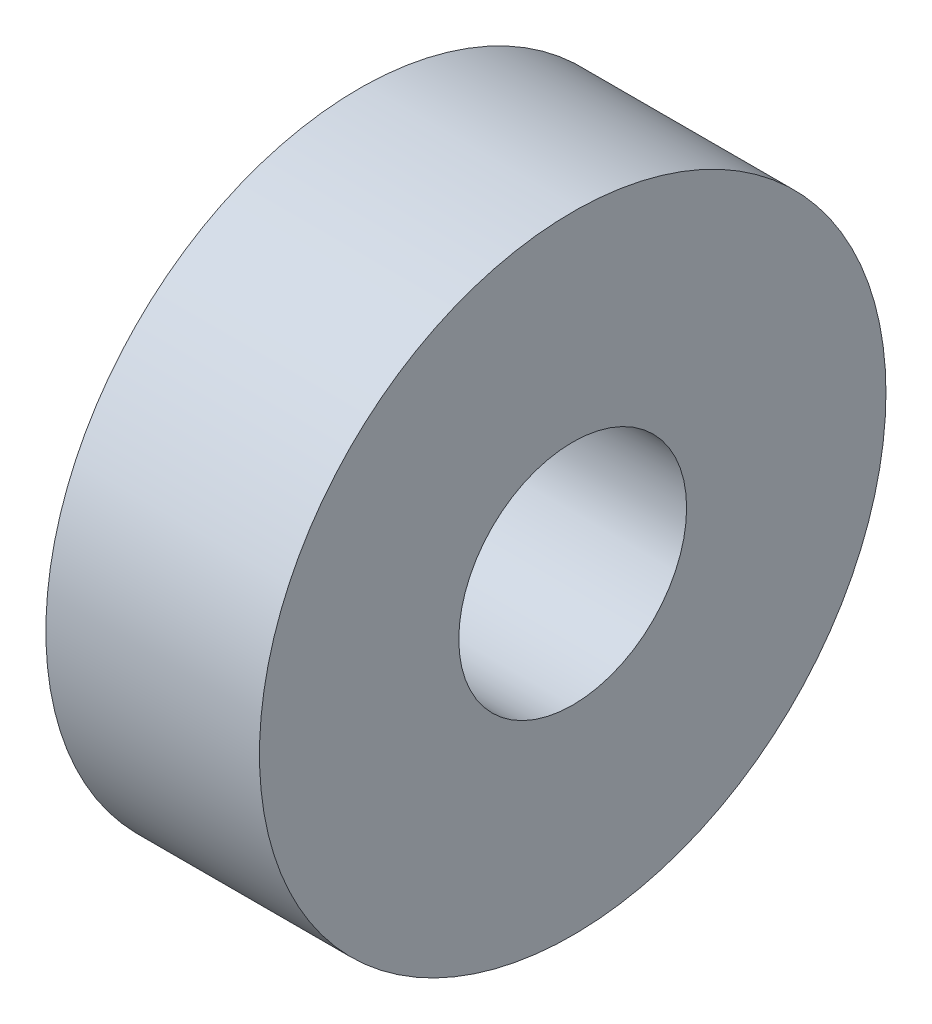
ISO-10303-21;
HEADER;
FILE_DESCRIPTION(('STEP AP214'),'2;1');
FILE_NAME('part.step','',(''),(''),'','','');
FILE_SCHEMA(('AUTOMOTIVE_DESIGN { 1 0 10303 214 1 1 1 1 }'));
ENDSEC;
DATA;
#1=APPLICATION_CONTEXT('core data for automotive mechanical design processes');
#2=APPLICATION_PROTOCOL_DEFINITION('international standard','automotive_design',2000,#1);
#3=PRODUCT_CONTEXT('',#1,'mechanical');
#4=PRODUCT('Part','Part','',(#3));
#5=PRODUCT_RELATED_PRODUCT_CATEGORY('part','',(#4));
#6=PRODUCT_DEFINITION_FORMATION('','',#4);
#7=PRODUCT_DEFINITION_CONTEXT('part definition',#1,'design');
#8=PRODUCT_DEFINITION('design','',#6,#7);
#9=PRODUCT_DEFINITION_SHAPE('','',#8);
#10=(LENGTH_UNIT() NAMED_UNIT(*) SI_UNIT(.MILLI.,.METRE.));
#11=(NAMED_UNIT(*) PLANE_ANGLE_UNIT() SI_UNIT($,.RADIAN.));
#12=(NAMED_UNIT(*) SI_UNIT($,.STERADIAN.) SOLID_ANGLE_UNIT());
#13=UNCERTAINTY_MEASURE_WITH_UNIT(LENGTH_MEASURE(1.E-05),#10,'distance_accuracy_value','');
#14=(GEOMETRIC_REPRESENTATION_CONTEXT(3) GLOBAL_UNCERTAINTY_ASSIGNED_CONTEXT((#13)) GLOBAL_UNIT_ASSIGNED_CONTEXT((#10,
#11,#12)) REPRESENTATION_CONTEXT('',''));
#15=CARTESIAN_POINT('',(0.,0.,0.));
#16=DIRECTION('',(0.,0.,1.));
#17=DIRECTION('',(1.,0.,0.));
#18=AXIS2_PLACEMENT_3D('',#15,#16,#17);
#19=CARTESIAN_POINT('',(7.5,0.,0.));
#20=DIRECTION('',(1.,0.,0.));
#21=DIRECTION('',(0.,0.,-1.));
#22=AXIS2_PLACEMENT_3D('',#19,#20,#21);
#23=PLANE('',#22);
#24=CARTESIAN_POINT('',(7.5,0.,0.));
#25=DIRECTION('',(1.,0.,0.));
#26=DIRECTION('',(0.,0.,-1.));
#27=AXIS2_PLACEMENT_3D('',#24,#25,#26);
#28=CIRCLE('',#27,11.);
#29=CARTESIAN_POINT('',(7.5,0.,-11.));
#30=VERTEX_POINT('',#29);
#31=EDGE_CURVE('E10',#30,#30,#28,.T.);
#32=ORIENTED_EDGE('',*,*,#31,.T.);
#33=EDGE_LOOP('',(#32));
#34=FACE_BOUND('',#33,.T.);
#35=CARTESIAN_POINT('',(7.5,0.,0.));
#36=DIRECTION('',(1.,0.,0.));
#37=DIRECTION('',(0.,0.,-1.));
#38=AXIS2_PLACEMENT_3D('',#35,#36,#37);
#39=CIRCLE('',#38,4.);
#40=CARTESIAN_POINT('',(7.5,0.,-4.));
#41=VERTEX_POINT('',#40);
#42=EDGE_CURVE('E42',#41,#41,#39,.T.);
#43=ORIENTED_EDGE('',*,*,#42,.F.);
#44=EDGE_LOOP('',(#43));
#45=FACE_BOUND('',#44,.T.);
#46=ADVANCED_FACE('F31',(#34,#45),#23,.T.);
#47=CARTESIAN_POINT('',(0.,0.,0.));
#48=DIRECTION('',(1.,0.,0.));
#49=DIRECTION('',(0.,0.,-1.));
#50=AXIS2_PLACEMENT_3D('',#47,#48,#49);
#51=PLANE('',#50);
#52=CARTESIAN_POINT('',(0.,0.,0.));
#53=DIRECTION('',(1.,0.,0.));
#54=DIRECTION('',(0.,0.,-1.));
#55=AXIS2_PLACEMENT_3D('',#52,#53,#54);
#56=CIRCLE('',#55,11.);
#57=CARTESIAN_POINT('',(0.,0.,-11.));
#58=VERTEX_POINT('',#57);
#59=EDGE_CURVE('E35',#58,#58,#56,.T.);
#60=ORIENTED_EDGE('',*,*,#59,.F.);
#61=EDGE_LOOP('',(#60));
#62=FACE_BOUND('',#61,.T.);
#63=CARTESIAN_POINT('',(0.,0.,0.));
#64=DIRECTION('',(1.,0.,0.));
#65=DIRECTION('',(0.,0.,-1.));
#66=AXIS2_PLACEMENT_3D('',#63,#64,#65);
#67=CIRCLE('',#66,4.);
#68=CARTESIAN_POINT('',(0.,0.,-4.));
#69=VERTEX_POINT('',#68);
#70=EDGE_CURVE('E44',#69,#69,#67,.T.);
#71=ORIENTED_EDGE('',*,*,#70,.T.);
#72=EDGE_LOOP('',(#71));
#73=FACE_BOUND('',#72,.T.);
#74=ADVANCED_FACE('F54',(#62,#73),#51,.F.);
#75=CARTESIAN_POINT('',(7.5,0.,0.));
#76=DIRECTION('',(-1.,0.,0.));
#77=DIRECTION('',(0.,0.,1.));
#78=AXIS2_PLACEMENT_3D('',#75,#76,#77);
#79=CYLINDRICAL_SURFACE('',#78,11.);
#80=ORIENTED_EDGE('',*,*,#31,.F.);
#81=EDGE_LOOP('',(#80));
#82=FACE_BOUND('',#81,.T.);
#83=ORIENTED_EDGE('',*,*,#59,.T.);
#84=EDGE_LOOP('',(#83));
#85=FACE_BOUND('',#84,.T.);
#86=ADVANCED_FACE('F33',(#82,#85),#79,.T.);
#87=CARTESIAN_POINT('',(7.5,0.,0.));
#88=DIRECTION('',(-1.,0.,0.));
#89=DIRECTION('',(0.,0.,1.));
#90=AXIS2_PLACEMENT_3D('',#87,#88,#89);
#91=CYLINDRICAL_SURFACE('',#90,4.);
#92=ORIENTED_EDGE('',*,*,#42,.T.);
#93=EDGE_LOOP('',(#92));
#94=FACE_BOUND('',#93,.T.);
#95=ORIENTED_EDGE('',*,*,#70,.F.);
#96=EDGE_LOOP('',(#95));
#97=FACE_BOUND('',#96,.T.);
#98=ADVANCED_FACE('F50',(#94,#97),#91,.F.);
#99=CLOSED_SHELL('',(#46,#74,#86,#98));
#100=MANIFOLD_SOLID_BREP('B2',#99);
#101=ADVANCED_BREP_SHAPE_REPRESENTATION('',(#18,#100),#14);
#102=SHAPE_DEFINITION_REPRESENTATION(#9,#101);
ENDSEC;
END-ISO-10303-21;
